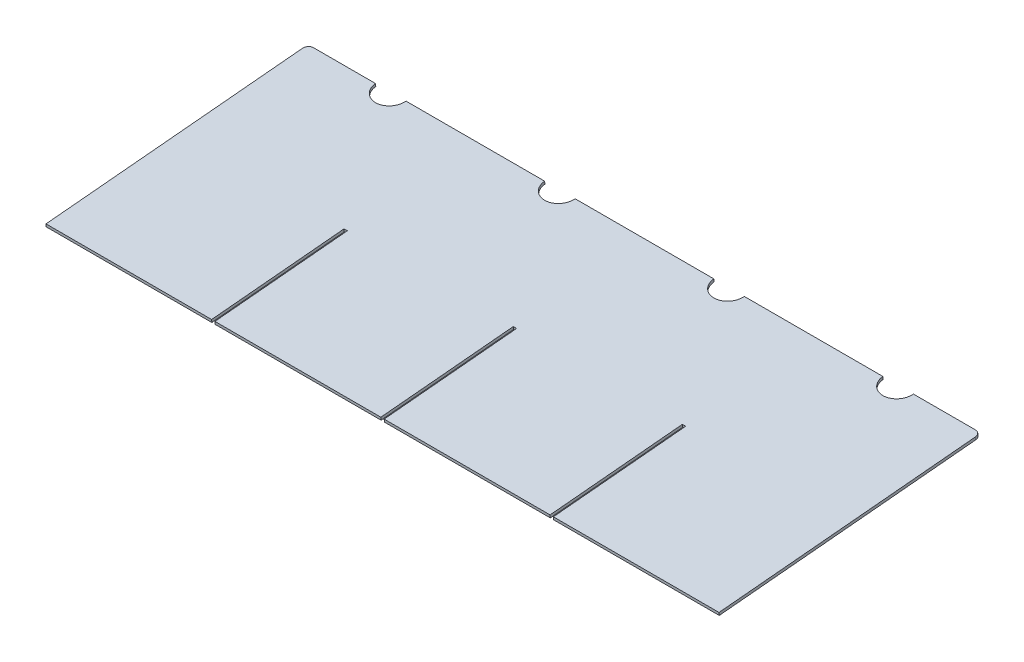
ISO-10303-21;
HEADER;
FILE_DESCRIPTION(('STEP AP214'),'2;1');
FILE_NAME('part.step','',(''),(''),'','','');
FILE_SCHEMA(('AUTOMOTIVE_DESIGN { 1 0 10303 214 1 1 1 1 }'));
ENDSEC;
DATA;
#1=APPLICATION_CONTEXT('core data for automotive mechanical design processes');
#2=APPLICATION_PROTOCOL_DEFINITION('international standard','automotive_design',2000,#1);
#3=PRODUCT_CONTEXT('',#1,'mechanical');
#4=PRODUCT('Part','Part','',(#3));
#5=PRODUCT_RELATED_PRODUCT_CATEGORY('part','',(#4));
#6=PRODUCT_DEFINITION_FORMATION('','',#4);
#7=PRODUCT_DEFINITION_CONTEXT('part definition',#1,'design');
#8=PRODUCT_DEFINITION('design','',#6,#7);
#9=PRODUCT_DEFINITION_SHAPE('','',#8);
#10=(LENGTH_UNIT() NAMED_UNIT(*) SI_UNIT(.MILLI.,.METRE.));
#11=(NAMED_UNIT(*) PLANE_ANGLE_UNIT() SI_UNIT($,.RADIAN.));
#12=(NAMED_UNIT(*) SI_UNIT($,.STERADIAN.) SOLID_ANGLE_UNIT());
#13=UNCERTAINTY_MEASURE_WITH_UNIT(LENGTH_MEASURE(1.E-05),#10,'distance_accuracy_value','');
#14=(GEOMETRIC_REPRESENTATION_CONTEXT(3) GLOBAL_UNCERTAINTY_ASSIGNED_CONTEXT((#13)) GLOBAL_UNIT_ASSIGNED_CONTEXT((#10,
#11,#12)) REPRESENTATION_CONTEXT('',''));
#15=CARTESIAN_POINT('',(0.,0.,0.));
#16=DIRECTION('',(0.,0.,1.));
#17=DIRECTION('',(1.,0.,0.));
#18=AXIS2_PLACEMENT_3D('',#15,#16,#17);
#19=CARTESIAN_POINT('',(61.7000000001972,-30.8304466529325,906.628961888731));
#20=DIRECTION('',(0.,-0.0925004132672426,0.995712646070838));
#21=DIRECTION('',(0.,-0.995712646070838,-0.0925004132672426));
#22=AXIS2_PLACEMENT_3D('',#19,#20,#21);
#23=PLANE('',#22);
#24=DIRECTION('',(1.,0.,0.));
#25=VECTOR('',#24,1.);
#26=CARTESIAN_POINT('',(61.7000000001972,-29.8347340068617,906.721462301998));
#27=LINE('',#26,#25);
#28=CARTESIAN_POINT('',(61.7000000001972,-29.8347340068617,906.721462301998));
#29=VERTEX_POINT('',#28);
#30=CARTESIAN_POINT('',(121.500000000197,-29.834734006862,906.721462301998));
#31=VERTEX_POINT('',#30);
#32=EDGE_CURVE('E239',#29,#31,#27,.T.);
#33=ORIENTED_EDGE('',*,*,#32,.F.);
#34=DIRECTION('',(0.,0.995712646070838,0.0925004132672426));
#35=VECTOR('',#34,1.);
#36=CARTESIAN_POINT('',(61.7000000001972,-30.8304466529325,906.628961888731));
#37=LINE('',#36,#35);
#38=CARTESIAN_POINT('',(61.7000000001972,-30.8304466529325,906.628961888731));
#39=VERTEX_POINT('',#38);
#40=EDGE_CURVE('E11',#39,#29,#37,.T.);
#41=ORIENTED_EDGE('',*,*,#40,.F.);
#42=DIRECTION('',(1.,0.,0.));
#43=VECTOR('',#42,1.);
#44=CARTESIAN_POINT('',(61.7000000001972,-30.8304466529325,906.628961888731));
#45=LINE('',#44,#43);
#46=CARTESIAN_POINT('',(121.500000000197,-30.8304466529328,906.628961888731));
#47=VERTEX_POINT('',#46);
#48=EDGE_CURVE('E313',#39,#47,#45,.T.);
#49=ORIENTED_EDGE('',*,*,#48,.T.);
#50=DIRECTION('',(0.,0.995712646070838,0.0925004132672426));
#51=VECTOR('',#50,1.);
#52=CARTESIAN_POINT('',(121.500000000197,-30.8304466529328,906.628961888731));
#53=LINE('',#52,#51);
#54=EDGE_CURVE('E37',#47,#31,#53,.T.);
#55=ORIENTED_EDGE('',*,*,#54,.T.);
#56=EDGE_LOOP('',(#33,#41,#49,#55));
#57=FACE_BOUND('',#56,.T.);
#58=ADVANCED_FACE('F34',(#57),#23,.T.);
#59=CARTESIAN_POINT('',(61.7000000001972,-26.3904268161048,858.83475487733));
#60=DIRECTION('',(-1.,0.,0.));
#61=DIRECTION('',(0.,-1.,0.));
#62=AXIS2_PLACEMENT_3D('',#59,#60,#61);
#63=PLANE('',#62);
#64=DIRECTION('',(0.,-0.0925004132672426,0.995712646070838));
#65=VECTOR('',#64,1.);
#66=CARTESIAN_POINT('',(61.7000000001972,-25.3947141700339,858.927255290597));
#67=LINE('',#66,#65);
#68=CARTESIAN_POINT('',(61.7000000001972,-25.3947141700339,858.927255290597));
#69=VERTEX_POINT('',#68);
#70=EDGE_CURVE('E311',#69,#29,#67,.T.);
#71=ORIENTED_EDGE('',*,*,#70,.F.);
#72=DIRECTION('',(0.,0.995712646070838,0.0925004132672426));
#73=VECTOR('',#72,1.);
#74=CARTESIAN_POINT('',(61.7000000001972,-26.3904268161048,858.83475487733));
#75=LINE('',#74,#73);
#76=CARTESIAN_POINT('',(61.7000000001972,-26.3904268161048,858.83475487733));
#77=VERTEX_POINT('',#76);
#78=EDGE_CURVE('E43',#77,#69,#75,.T.);
#79=ORIENTED_EDGE('',*,*,#78,.F.);
#80=DIRECTION('',(0.,-0.0925004132672426,0.995712646070838));
#81=VECTOR('',#80,1.);
#82=CARTESIAN_POINT('',(61.7000000001972,-26.3904268161048,858.83475487733));
#83=LINE('',#82,#81);
#84=EDGE_CURVE('E229',#77,#39,#83,.T.);
#85=ORIENTED_EDGE('',*,*,#84,.T.);
#86=ORIENTED_EDGE('',*,*,#40,.T.);
#87=EDGE_LOOP('',(#71,#79,#85,#86));
#88=FACE_BOUND('',#87,.T.);
#89=ADVANCED_FACE('F361',(#88),#63,.T.);
#90=CARTESIAN_POINT('',(60.5000000001972,-26.3913263339,858.84443765833));
#91=DIRECTION('',(0.00810346164109908,-0.0924973761471252,0.995679953255728));
#92=DIRECTION('',(0.,-0.995712646070838,-0.0925004132672426));
#93=AXIS2_PLACEMENT_3D('',#90,#91,#92);
#94=PLANE('',#93);
#95=DIRECTION('',(0.999967166415694,0.000749573550690543,-0.00806871923299289));
#96=VECTOR('',#95,1.);
#97=CARTESIAN_POINT('',(60.5000000001972,-25.3956136878292,858.936938071597));
#98=LINE('',#97,#96);
#99=CARTESIAN_POINT('',(60.5000000001972,-25.3956136878292,858.936938071597));
#100=VERTEX_POINT('',#99);
#101=EDGE_CURVE('E216',#100,#69,#98,.T.);
#102=ORIENTED_EDGE('',*,*,#101,.F.);
#103=DIRECTION('',(0.,0.995712646070838,0.0925004132672426));
#104=VECTOR('',#103,1.);
#105=CARTESIAN_POINT('',(60.5000000001972,-26.3913263339,858.84443765833));
#106=LINE('',#105,#104);
#107=CARTESIAN_POINT('',(60.5000000001972,-26.3913263339,858.84443765833));
#108=VERTEX_POINT('',#107);
#109=EDGE_CURVE('E211',#108,#100,#106,.T.);
#110=ORIENTED_EDGE('',*,*,#109,.F.);
#111=DIRECTION('',(0.999967166415694,0.000749573550690543,-0.00806871923299289));
#112=VECTOR('',#111,1.);
#113=CARTESIAN_POINT('',(60.5000000001972,-26.3913263339,858.84443765833));
#114=LINE('',#113,#112);
#115=EDGE_CURVE('E214',#108,#77,#114,.T.);
#116=ORIENTED_EDGE('',*,*,#115,.T.);
#117=ORIENTED_EDGE('',*,*,#78,.T.);
#118=EDGE_LOOP('',(#102,#110,#116,#117));
#119=FACE_BOUND('',#118,.T.);
#120=ADVANCED_FACE('F213',(#119),#94,.T.);
#121=CARTESIAN_POINT('',(60.5000000001972,-30.8304466529325,906.628961888731));
#122=DIRECTION('',(1.,0.,0.));
#123=DIRECTION('',(0.,1.,0.));
#124=AXIS2_PLACEMENT_3D('',#121,#122,#123);
#125=PLANE('',#124);
#126=DIRECTION('',(0.,0.0925004132672425,-0.995712646070838));
#127=VECTOR('',#126,1.);
#128=CARTESIAN_POINT('',(60.5000000001972,-29.8347340068616,906.721462301998));
#129=LINE('',#128,#127);
#130=CARTESIAN_POINT('',(60.5000000001972,-29.8347340068616,906.721462301998));
#131=VERTEX_POINT('',#130);
#132=EDGE_CURVE('E308',#131,#100,#129,.T.);
#133=ORIENTED_EDGE('',*,*,#132,.F.);
#134=DIRECTION('',(0.,0.995712646070838,0.0925004132672426));
#135=VECTOR('',#134,1.);
#136=CARTESIAN_POINT('',(60.5000000001972,-30.8304466529325,906.628961888731));
#137=LINE('',#136,#135);
#138=CARTESIAN_POINT('',(60.5000000001972,-30.8304466529325,906.628961888731));
#139=VERTEX_POINT('',#138);
#140=EDGE_CURVE('E221',#139,#131,#137,.T.);
#141=ORIENTED_EDGE('',*,*,#140,.F.);
#142=DIRECTION('',(0.,0.0925004132672425,-0.995712646070838));
#143=VECTOR('',#142,1.);
#144=CARTESIAN_POINT('',(60.5000000001972,-30.8304466529325,906.628961888731));
#145=LINE('',#144,#143);
#146=EDGE_CURVE('E227',#139,#108,#145,.T.);
#147=ORIENTED_EDGE('',*,*,#146,.T.);
#148=ORIENTED_EDGE('',*,*,#109,.T.);
#149=EDGE_LOOP('',(#133,#141,#147,#148));
#150=FACE_BOUND('',#149,.T.);
#151=ADVANCED_FACE('F231',(#150),#125,.T.);
#152=CARTESIAN_POINT('',(0.600000000197105,-30.8304466529322,906.628961888731));
#153=DIRECTION('',(0.,-0.0925004132672426,0.995712646070838));
#154=DIRECTION('',(0.,-0.995712646070838,-0.0925004132672426));
#155=AXIS2_PLACEMENT_3D('',#152,#153,#154);
#156=PLANE('',#155);
#157=DIRECTION('',(1.,0.,0.));
#158=VECTOR('',#157,1.);
#159=CARTESIAN_POINT('',(0.60000000019711,-29.8347340068613,906.721462301998));
#160=LINE('',#159,#158);
#161=CARTESIAN_POINT('',(0.60000000019711,-29.8347340068613,906.721462301998));
#162=VERTEX_POINT('',#161);
#163=EDGE_CURVE('E305',#162,#131,#160,.T.);
#164=ORIENTED_EDGE('',*,*,#163,.F.);
#165=DIRECTION('',(0.,0.995712646070838,0.0925004132672426));
#166=VECTOR('',#165,1.);
#167=CARTESIAN_POINT('',(0.600000000197105,-30.8304466529322,906.628961888731));
#168=LINE('',#167,#166);
#169=CARTESIAN_POINT('',(0.600000000197105,-30.8304466529322,906.628961888731));
#170=VERTEX_POINT('',#169);
#171=EDGE_CURVE('E317',#170,#162,#168,.T.);
#172=ORIENTED_EDGE('',*,*,#171,.F.);
#173=DIRECTION('',(1.,0.,0.));
#174=VECTOR('',#173,1.);
#175=CARTESIAN_POINT('',(0.600000000197105,-30.8304466529322,906.628961888731));
#176=LINE('',#175,#174);
#177=EDGE_CURVE('E232',#170,#139,#176,.T.);
#178=ORIENTED_EDGE('',*,*,#177,.T.);
#179=ORIENTED_EDGE('',*,*,#140,.T.);
#180=EDGE_LOOP('',(#164,#172,#178,#179));
#181=FACE_BOUND('',#180,.T.);
#182=ADVANCED_FACE('F374',(#181),#156,.T.);
#183=CARTESIAN_POINT('',(0.600000000197216,-26.3904268161045,858.834754877331));
#184=DIRECTION('',(-1.,0.,0.));
#185=DIRECTION('',(0.,-1.,0.));
#186=AXIS2_PLACEMENT_3D('',#183,#184,#185);
#187=PLANE('',#186);
#188=DIRECTION('',(0.,-0.0925004132672426,0.995712646070838));
#189=VECTOR('',#188,1.);
#190=CARTESIAN_POINT('',(0.600000000197221,-25.3947141700337,858.927255290598));
#191=LINE('',#190,#189);
#192=CARTESIAN_POINT('',(0.600000000197221,-25.3947141700337,858.927255290598));
#193=VERTEX_POINT('',#192);
#194=EDGE_CURVE('E302',#193,#162,#191,.T.);
#195=ORIENTED_EDGE('',*,*,#194,.F.);
#196=DIRECTION('',(0.,0.995712646070838,0.0925004132672426));
#197=VECTOR('',#196,1.);
#198=CARTESIAN_POINT('',(0.600000000197216,-26.3904268161045,858.834754877331));
#199=LINE('',#198,#197);
#200=CARTESIAN_POINT('',(0.600000000197216,-26.3904268161045,858.834754877331));
#201=VERTEX_POINT('',#200);
#202=EDGE_CURVE('E319',#201,#193,#199,.T.);
#203=ORIENTED_EDGE('',*,*,#202,.F.);
#204=DIRECTION('',(0.,-0.0925004132672426,0.995712646070838));
#205=VECTOR('',#204,1.);
#206=CARTESIAN_POINT('',(0.600000000197216,-26.3904268161045,858.834754877331));
#207=LINE('',#206,#205);
#208=EDGE_CURVE('E234',#201,#170,#207,.T.);
#209=ORIENTED_EDGE('',*,*,#208,.T.);
#210=ORIENTED_EDGE('',*,*,#171,.T.);
#211=EDGE_LOOP('',(#195,#203,#209,#210));
#212=FACE_BOUND('',#211,.T.);
#213=ADVANCED_FACE('F377',(#212),#187,.T.);
#214=CARTESIAN_POINT('',(-0.599999999802874,-26.3904268161045,858.83475487733));
#215=DIRECTION('',(-7.4339390925609E-13,-0.0925004132672426,0.995712646070838));
#216=DIRECTION('',(0.,-0.995712646070838,-0.0925004132672426));
#217=AXIS2_PLACEMENT_3D('',#214,#215,#216);
#218=PLANE('',#217);
#219=DIRECTION('',(1.,0.,7.40148683083382E-13));
#220=VECTOR('',#219,1.);
#221=CARTESIAN_POINT('',(-0.599999999802869,-25.3947141700336,858.927255290597));
#222=LINE('',#221,#220);
#223=CARTESIAN_POINT('',(-0.599999999802869,-25.3947141700336,858.927255290597));
#224=VERTEX_POINT('',#223);
#225=EDGE_CURVE('E299',#224,#193,#222,.T.);
#226=ORIENTED_EDGE('',*,*,#225,.F.);
#227=DIRECTION('',(0.,0.995712646070838,0.0925004132672426));
#228=VECTOR('',#227,1.);
#229=CARTESIAN_POINT('',(-0.599999999802874,-26.3904268161045,858.83475487733));
#230=LINE('',#229,#228);
#231=CARTESIAN_POINT('',(-0.599999999802874,-26.3904268161045,858.83475487733));
#232=VERTEX_POINT('',#231);
#233=EDGE_CURVE('E321',#232,#224,#230,.T.);
#234=ORIENTED_EDGE('',*,*,#233,.F.);
#235=DIRECTION('',(1.,0.,7.40148683083382E-13));
#236=VECTOR('',#235,1.);
#237=CARTESIAN_POINT('',(-0.599999999802874,-26.3904268161045,858.83475487733));
#238=LINE('',#237,#236);
#239=EDGE_CURVE('E698',#232,#201,#238,.T.);
#240=ORIENTED_EDGE('',*,*,#239,.T.);
#241=ORIENTED_EDGE('',*,*,#202,.T.);
#242=EDGE_LOOP('',(#226,#234,#240,#241));
#243=FACE_BOUND('',#242,.T.);
#244=ADVANCED_FACE('F381',(#243),#218,.T.);
#245=CARTESIAN_POINT('',(-0.599999999802874,-30.8304466529322,906.628961888731));
#246=DIRECTION('',(1.,0.,0.));
#247=DIRECTION('',(0.,1.,0.));
#248=AXIS2_PLACEMENT_3D('',#245,#246,#247);
#249=PLANE('',#248);
#250=DIRECTION('',(0.,0.0925004132672426,-0.995712646070838));
#251=VECTOR('',#250,1.);
#252=CARTESIAN_POINT('',(-0.599999999802869,-29.8347340068613,906.721462301998));
#253=LINE('',#252,#251);
#254=CARTESIAN_POINT('',(-0.599999999802869,-29.8347340068613,906.721462301998));
#255=VERTEX_POINT('',#254);
#256=EDGE_CURVE('E296',#255,#224,#253,.T.);
#257=ORIENTED_EDGE('',*,*,#256,.F.);
#258=DIRECTION('',(0.,0.995712646070838,0.0925004132672426));
#259=VECTOR('',#258,1.);
#260=CARTESIAN_POINT('',(-0.599999999802874,-30.8304466529322,906.628961888731));
#261=LINE('',#260,#259);
#262=CARTESIAN_POINT('',(-0.599999999802874,-30.8304466529322,906.628961888731));
#263=VERTEX_POINT('',#262);
#264=EDGE_CURVE('E323',#263,#255,#261,.T.);
#265=ORIENTED_EDGE('',*,*,#264,.F.);
#266=DIRECTION('',(0.,0.0925004132672426,-0.995712646070838));
#267=VECTOR('',#266,1.);
#268=CARTESIAN_POINT('',(-0.599999999802874,-30.8304466529322,906.628961888731));
#269=LINE('',#268,#267);
#270=EDGE_CURVE('E691',#263,#232,#269,.T.);
#271=ORIENTED_EDGE('',*,*,#270,.T.);
#272=ORIENTED_EDGE('',*,*,#233,.T.);
#273=EDGE_LOOP('',(#257,#265,#271,#272));
#274=FACE_BOUND('',#273,.T.);
#275=ADVANCED_FACE('F385',(#274),#249,.T.);
#276=CARTESIAN_POINT('',(-60.4999999998028,-30.8304466529319,906.628961888731));
#277=DIRECTION('',(0.,-0.0925004132672426,0.995712646070838));
#278=DIRECTION('',(0.,-0.995712646070838,-0.0925004132672426));
#279=AXIS2_PLACEMENT_3D('',#276,#277,#278);
#280=PLANE('',#279);
#281=DIRECTION('',(1.,0.,0.));
#282=VECTOR('',#281,1.);
#283=CARTESIAN_POINT('',(-60.4999999998028,-29.834734006861,906.721462301998));
#284=LINE('',#283,#282);
#285=CARTESIAN_POINT('',(-60.4999999998028,-29.834734006861,906.721462301998));
#286=VERTEX_POINT('',#285);
#287=EDGE_CURVE('E293',#286,#255,#284,.T.);
#288=ORIENTED_EDGE('',*,*,#287,.F.);
#289=DIRECTION('',(0.,0.995712646070838,0.0925004132672426));
#290=VECTOR('',#289,1.);
#291=CARTESIAN_POINT('',(-60.4999999998028,-30.8304466529319,906.628961888731));
#292=LINE('',#291,#290);
#293=CARTESIAN_POINT('',(-60.4999999998028,-30.8304466529319,906.628961888731));
#294=VERTEX_POINT('',#293);
#295=EDGE_CURVE('E325',#294,#286,#292,.T.);
#296=ORIENTED_EDGE('',*,*,#295,.F.);
#297=DIRECTION('',(1.,0.,0.));
#298=VECTOR('',#297,1.);
#299=CARTESIAN_POINT('',(-60.4999999998028,-30.8304466529319,906.628961888731));
#300=LINE('',#299,#298);
#301=EDGE_CURVE('E687',#294,#263,#300,.T.);
#302=ORIENTED_EDGE('',*,*,#301,.T.);
#303=ORIENTED_EDGE('',*,*,#264,.T.);
#304=EDGE_LOOP('',(#288,#296,#302,#303));
#305=FACE_BOUND('',#304,.T.);
#306=ADVANCED_FACE('F389',(#305),#280,.T.);
#307=CARTESIAN_POINT('',(-60.4999999998028,-26.3904268161042,858.83475487733));
#308=DIRECTION('',(-1.,0.,0.));
#309=DIRECTION('',(0.,-1.,0.));
#310=AXIS2_PLACEMENT_3D('',#307,#308,#309);
#311=PLANE('',#310);
#312=DIRECTION('',(0.,-0.0925004132672426,0.995712646070838));
#313=VECTOR('',#312,1.);
#314=CARTESIAN_POINT('',(-60.4999999998028,-25.3947141700333,858.927255290597));
#315=LINE('',#314,#313);
#316=CARTESIAN_POINT('',(-60.4999999998028,-25.3947141700333,858.927255290597));
#317=VERTEX_POINT('',#316);
#318=EDGE_CURVE('E290',#317,#286,#315,.T.);
#319=ORIENTED_EDGE('',*,*,#318,.F.);
#320=DIRECTION('',(0.,0.995712646070838,0.0925004132672426));
#321=VECTOR('',#320,1.);
#322=CARTESIAN_POINT('',(-60.4999999998028,-26.3904268161042,858.83475487733));
#323=LINE('',#322,#321);
#324=CARTESIAN_POINT('',(-60.4999999998028,-26.3904268161042,858.83475487733));
#325=VERTEX_POINT('',#324);
#326=EDGE_CURVE('E327',#325,#317,#323,.T.);
#327=ORIENTED_EDGE('',*,*,#326,.F.);
#328=DIRECTION('',(0.,-0.0925004132672426,0.995712646070838));
#329=VECTOR('',#328,1.);
#330=CARTESIAN_POINT('',(-60.4999999998028,-26.3904268161042,858.83475487733));
#331=LINE('',#330,#329);
#332=EDGE_CURVE('E703',#325,#294,#331,.T.);
#333=ORIENTED_EDGE('',*,*,#332,.T.);
#334=ORIENTED_EDGE('',*,*,#295,.T.);
#335=EDGE_LOOP('',(#319,#327,#333,#334));
#336=FACE_BOUND('',#335,.T.);
#337=ADVANCED_FACE('F393',(#336),#311,.T.);
#338=CARTESIAN_POINT('',(-61.6999999998028,-26.3895094566338,858.824880041171));
#339=DIRECTION('',(-0.00826418058718151,-0.0924972544777096,0.995678643555896));
#340=DIRECTION('',(0.,-0.995712646070838,-0.0925004132672425));
#341=AXIS2_PLACEMENT_3D('',#338,#339,#340);
#342=PLANE('',#341);
#343=DIRECTION('',(0.999965851076537,-0.000764440119635503,0.00822874912006918));
#344=VECTOR('',#343,1.);
#345=CARTESIAN_POINT('',(-61.6999999998028,-25.3937968105629,858.917380454438));
#346=LINE('',#345,#344);
#347=CARTESIAN_POINT('',(-61.6999999998028,-25.3937968105629,858.917380454438));
#348=VERTEX_POINT('',#347);
#349=EDGE_CURVE('E287',#348,#317,#346,.T.);
#350=ORIENTED_EDGE('',*,*,#349,.F.);
#351=DIRECTION('',(0.,0.995712646070838,0.0925004132672426));
#352=VECTOR('',#351,1.);
#353=CARTESIAN_POINT('',(-61.6999999998028,-26.3895094566338,858.824880041171));
#354=LINE('',#353,#352);
#355=CARTESIAN_POINT('',(-61.6999999998028,-26.3895094566338,858.824880041171));
#356=VERTEX_POINT('',#355);
#357=EDGE_CURVE('E329',#356,#348,#354,.T.);
#358=ORIENTED_EDGE('',*,*,#357,.F.);
#359=DIRECTION('',(0.999965851076537,-0.000764440119635503,0.00822874912006918));
#360=VECTOR('',#359,1.);
#361=CARTESIAN_POINT('',(-61.6999999998028,-26.3895094566338,858.824880041171));
#362=LINE('',#361,#360);
#363=EDGE_CURVE('E680',#356,#325,#362,.T.);
#364=ORIENTED_EDGE('',*,*,#363,.T.);
#365=ORIENTED_EDGE('',*,*,#326,.T.);
#366=EDGE_LOOP('',(#350,#358,#364,#365));
#367=FACE_BOUND('',#366,.T.);
#368=ADVANCED_FACE('F397',(#367),#342,.T.);
#369=CARTESIAN_POINT('',(-61.6999999998028,-30.8304466529319,906.628961888731));
#370=DIRECTION('',(1.,0.,0.));
#371=DIRECTION('',(0.,1.,0.));
#372=AXIS2_PLACEMENT_3D('',#369,#370,#371);
#373=PLANE('',#372);
#374=DIRECTION('',(0.,0.0925004132672425,-0.995712646070838));
#375=VECTOR('',#374,1.);
#376=CARTESIAN_POINT('',(-61.6999999998028,-29.834734006861,906.721462301998));
#377=LINE('',#376,#375);
#378=CARTESIAN_POINT('',(-61.6999999998028,-29.834734006861,906.721462301998));
#379=VERTEX_POINT('',#378);
#380=EDGE_CURVE('E284',#379,#348,#377,.T.);
#381=ORIENTED_EDGE('',*,*,#380,.F.);
#382=DIRECTION('',(0.,0.995712646070838,0.0925004132672426));
#383=VECTOR('',#382,1.);
#384=CARTESIAN_POINT('',(-61.6999999998028,-30.8304466529319,906.628961888731));
#385=LINE('',#384,#383);
#386=CARTESIAN_POINT('',(-61.6999999998028,-30.8304466529319,906.628961888731));
#387=VERTEX_POINT('',#386);
#388=EDGE_CURVE('E331',#387,#379,#385,.T.);
#389=ORIENTED_EDGE('',*,*,#388,.F.);
#390=DIRECTION('',(0.,0.0925004132672425,-0.995712646070838));
#391=VECTOR('',#390,1.);
#392=CARTESIAN_POINT('',(-61.6999999998028,-30.8304466529319,906.628961888731));
#393=LINE('',#392,#391);
#394=EDGE_CURVE('E676',#387,#356,#393,.T.);
#395=ORIENTED_EDGE('',*,*,#394,.T.);
#396=ORIENTED_EDGE('',*,*,#357,.T.);
#397=EDGE_LOOP('',(#381,#389,#395,#396));
#398=FACE_BOUND('',#397,.T.);
#399=ADVANCED_FACE('F401',(#398),#373,.T.);
#400=CARTESIAN_POINT('',(-121.499999999803,-30.8304466529316,906.628961888731));
#401=DIRECTION('',(0.,-0.0925004132672426,0.995712646070838));
#402=DIRECTION('',(0.,-0.995712646070838,-0.0925004132672426));
#403=AXIS2_PLACEMENT_3D('',#400,#401,#402);
#404=PLANE('',#403);
#405=DIRECTION('',(1.,0.,0.));
#406=VECTOR('',#405,1.);
#407=CARTESIAN_POINT('',(-121.499999999803,-29.8347340068607,906.721462301998));
#408=LINE('',#407,#406);
#409=CARTESIAN_POINT('',(-121.499999999803,-29.8347340068607,906.721462301998));
#410=VERTEX_POINT('',#409);
#411=EDGE_CURVE('E281',#410,#379,#408,.T.);
#412=ORIENTED_EDGE('',*,*,#411,.F.);
#413=DIRECTION('',(0.,0.995712646070838,0.0925004132672426));
#414=VECTOR('',#413,1.);
#415=CARTESIAN_POINT('',(-121.499999999803,-30.8304466529316,906.628961888731));
#416=LINE('',#415,#414);
#417=CARTESIAN_POINT('',(-121.499999999803,-30.8304466529316,906.628961888731));
#418=VERTEX_POINT('',#417);
#419=EDGE_CURVE('E333',#418,#410,#416,.T.);
#420=ORIENTED_EDGE('',*,*,#419,.F.);
#421=DIRECTION('',(1.,0.,0.));
#422=VECTOR('',#421,1.);
#423=CARTESIAN_POINT('',(-121.499999999803,-30.8304466529316,906.628961888731));
#424=LINE('',#423,#422);
#425=EDGE_CURVE('E707',#418,#387,#424,.T.);
#426=ORIENTED_EDGE('',*,*,#425,.T.);
#427=ORIENTED_EDGE('',*,*,#388,.T.);
#428=EDGE_LOOP('',(#412,#420,#426,#427));
#429=FACE_BOUND('',#428,.T.);
#430=ADVANCED_FACE('F405',(#429),#404,.T.);
#431=CARTESIAN_POINT('',(-121.499999999803,-22.227908219078,814.027685804143));
#432=DIRECTION('',(-1.,0.,0.));
#433=DIRECTION('',(0.,-1.,0.));
#434=AXIS2_PLACEMENT_3D('',#431,#432,#433);
#435=PLANE('',#434);
#436=DIRECTION('',(0.,-0.0925004132672426,0.995712646070838));
#437=VECTOR('',#436,1.);
#438=CARTESIAN_POINT('',(-121.499999999803,-21.2321955730071,814.12018621741));
#439=LINE('',#438,#437);
#440=CARTESIAN_POINT('',(-121.499999999803,-21.2321955730071,814.12018621741));
#441=VERTEX_POINT('',#440);
#442=EDGE_CURVE('E278',#441,#410,#439,.T.);
#443=ORIENTED_EDGE('',*,*,#442,.F.);
#444=DIRECTION('',(0.,0.995712646070838,0.0925004132672426));
#445=VECTOR('',#444,1.);
#446=CARTESIAN_POINT('',(-121.499999999803,-22.227908219078,814.027685804143));
#447=LINE('',#446,#445);
#448=CARTESIAN_POINT('',(-121.499999999803,-22.227908219078,814.027685804143));
#449=VERTEX_POINT('',#448);
#450=EDGE_CURVE('E335',#449,#441,#447,.T.);
#451=ORIENTED_EDGE('',*,*,#450,.F.);
#452=DIRECTION('',(0.,-0.0925004132672426,0.995712646070838));
#453=VECTOR('',#452,1.);
#454=CARTESIAN_POINT('',(-121.499999999803,-22.227908219078,814.027685804143));
#455=LINE('',#454,#453);
#456=EDGE_CURVE('E669',#449,#418,#455,.T.);
#457=ORIENTED_EDGE('',*,*,#456,.T.);
#458=ORIENTED_EDGE('',*,*,#419,.T.);
#459=EDGE_LOOP('',(#443,#451,#457,#458));
#460=FACE_BOUND('',#459,.T.);
#461=ADVANCED_FACE('F409',(#460),#435,.T.);
#462=CARTESIAN_POINT('',(-119.499999999803,-22.227908219078,814.027685804143));
#463=DIRECTION('',(0.,0.995712646070838,0.0925004132672426));
#464=DIRECTION('',(0.,-0.0925004132672426,0.995712646070838));
#465=AXIS2_PLACEMENT_3D('',#462,#463,#464);
#466=CYLINDRICAL_SURFACE('',#465,2.00000000000012);
#467=CARTESIAN_POINT('',(-119.499999999803,-21.2321955730071,814.12018621741));
#468=DIRECTION('',(0.,0.995712646070838,0.0925004132672426));
#469=DIRECTION('',(0.,-0.0925004132672426,0.995712646070838));
#470=AXIS2_PLACEMENT_3D('',#467,#468,#469);
#471=CIRCLE('',#470,2.00000000000012);
#472=CARTESIAN_POINT('',(-119.499999999803,-21.0471947464726,812.128760925268));
#473=VERTEX_POINT('',#472);
#474=EDGE_CURVE('E275',#473,#441,#471,.T.);
#475=ORIENTED_EDGE('',*,*,#474,.F.);
#476=DIRECTION('',(0.,0.995712646070838,0.0925004132672426));
#477=VECTOR('',#476,1.);
#478=CARTESIAN_POINT('',(-119.499999999803,-22.0429073925435,812.036260512001));
#479=LINE('',#478,#477);
#480=CARTESIAN_POINT('',(-119.499999999803,-22.0429073925435,812.036260512001));
#481=VERTEX_POINT('',#480);
#482=EDGE_CURVE('E337',#481,#473,#479,.T.);
#483=ORIENTED_EDGE('',*,*,#482,.F.);
#484=CARTESIAN_POINT('',(-119.499999999803,-22.227908219078,814.027685804143));
#485=DIRECTION('',(0.,0.995712646070838,0.0925004132672426));
#486=DIRECTION('',(0.,-0.0925004132672426,0.995712646070838));
#487=AXIS2_PLACEMENT_3D('',#484,#485,#486);
#488=CIRCLE('',#487,2.00000000000012);
#489=EDGE_CURVE('E665',#481,#449,#488,.T.);
#490=ORIENTED_EDGE('',*,*,#489,.T.);
#491=ORIENTED_EDGE('',*,*,#450,.T.);
#492=EDGE_LOOP('',(#475,#483,#490,#491));
#493=FACE_BOUND('',#492,.T.);
#494=ADVANCED_FACE('F413',(#493),#466,.T.);
#495=CARTESIAN_POINT('',(-97.0999999998028,-22.0429073925436,812.036260512001));
#496=DIRECTION('',(0.,0.0925004132672426,-0.995712646070838));
#497=DIRECTION('',(0.,0.995712646070838,0.0925004132672426));
#498=AXIS2_PLACEMENT_3D('',#495,#496,#497);
#499=PLANE('',#498);
#500=DIRECTION('',(-1.,0.,0.));
#501=VECTOR('',#500,1.);
#502=CARTESIAN_POINT('',(-97.0999999998028,-21.0471947464727,812.128760925268));
#503=LINE('',#502,#501);
#504=CARTESIAN_POINT('',(-97.0999999998028,-21.0471947464727,812.128760925268));
#505=VERTEX_POINT('',#504);
#506=EDGE_CURVE('E272',#505,#473,#503,.T.);
#507=ORIENTED_EDGE('',*,*,#506,.F.);
#508=DIRECTION('',(0.,0.995712646070838,0.0925004132672426));
#509=VECTOR('',#508,1.);
#510=CARTESIAN_POINT('',(-97.0999999998028,-22.0429073925436,812.036260512001));
#511=LINE('',#510,#509);
#512=CARTESIAN_POINT('',(-97.0999999998028,-22.0429073925436,812.036260512001));
#513=VERTEX_POINT('',#512);
#514=EDGE_CURVE('E339',#513,#505,#511,.T.);
#515=ORIENTED_EDGE('',*,*,#514,.F.);
#516=DIRECTION('',(-1.,0.,0.));
#517=VECTOR('',#516,1.);
#518=CARTESIAN_POINT('',(-97.0999999998028,-22.0429073925436,812.036260512001));
#519=LINE('',#518,#517);
#520=EDGE_CURVE('E711',#513,#481,#519,.T.);
#521=ORIENTED_EDGE('',*,*,#520,.T.);
#522=ORIENTED_EDGE('',*,*,#482,.T.);
#523=EDGE_LOOP('',(#507,#515,#521,#522));
#524=FACE_BOUND('',#523,.T.);
#525=ADVANCED_FACE('F417',(#524),#499,.T.);
#526=CARTESIAN_POINT('',(-91.5999999998028,-22.0429073925436,812.036260512001));
#527=DIRECTION('',(0.,0.995712646070838,0.0925004132672426));
#528=DIRECTION('',(0.,-0.0925004132672426,0.995712646070838));
#529=AXIS2_PLACEMENT_3D('',#526,#527,#528);
#530=CYLINDRICAL_SURFACE('',#529,5.5);
#531=CARTESIAN_POINT('',(-91.5999999998028,-21.0471947464728,812.128760925268));
#532=DIRECTION('',(0.,-0.995712646070838,-0.0925004132672426));
#533=DIRECTION('',(0.,0.0925004132672426,-0.995712646070838));
#534=AXIS2_PLACEMENT_3D('',#531,#532,#533);
#535=CIRCLE('',#534,5.5);
#536=CARTESIAN_POINT('',(-86.0999999998028,-21.0471947464728,812.128760925268));
#537=VERTEX_POINT('',#536);
#538=EDGE_CURVE('E269',#537,#505,#535,.T.);
#539=ORIENTED_EDGE('',*,*,#538,.F.);
#540=DIRECTION('',(0.,0.995712646070838,0.0925004132672426));
#541=VECTOR('',#540,1.);
#542=CARTESIAN_POINT('',(-86.0999999998028,-22.0429073925436,812.036260512001));
#543=LINE('',#542,#541);
#544=CARTESIAN_POINT('',(-86.0999999998028,-22.0429073925436,812.036260512001));
#545=VERTEX_POINT('',#544);
#546=EDGE_CURVE('E341',#545,#537,#543,.T.);
#547=ORIENTED_EDGE('',*,*,#546,.F.);
#548=CARTESIAN_POINT('',(-91.5999999998028,-22.0429073925436,812.036260512001));
#549=DIRECTION('',(0.,-0.995712646070838,-0.0925004132672426));
#550=DIRECTION('',(0.,0.0925004132672426,-0.995712646070838));
#551=AXIS2_PLACEMENT_3D('',#548,#549,#550);
#552=CIRCLE('',#551,5.5);
#553=EDGE_CURVE('E658',#545,#513,#552,.T.);
#554=ORIENTED_EDGE('',*,*,#553,.T.);
#555=ORIENTED_EDGE('',*,*,#514,.T.);
#556=EDGE_LOOP('',(#539,#547,#554,#555));
#557=FACE_BOUND('',#556,.T.);
#558=ADVANCED_FACE('F421',(#557),#530,.F.);
#559=CARTESIAN_POINT('',(-36.0499999998028,-22.0429073925439,812.036260512001));
#560=DIRECTION('',(0.,0.0925004132672426,-0.995712646070838));
#561=DIRECTION('',(0.,0.995712646070838,0.0925004132672426));
#562=AXIS2_PLACEMENT_3D('',#559,#560,#561);
#563=PLANE('',#562);
#564=DIRECTION('',(-1.,0.,0.));
#565=VECTOR('',#564,1.);
#566=CARTESIAN_POINT('',(-36.0499999998028,-21.0471947464731,812.128760925268));
#567=LINE('',#566,#565);
#568=CARTESIAN_POINT('',(-36.0499999998028,-21.0471947464731,812.128760925268));
#569=VERTEX_POINT('',#568);
#570=EDGE_CURVE('E266',#569,#537,#567,.T.);
#571=ORIENTED_EDGE('',*,*,#570,.F.);
#572=DIRECTION('',(0.,0.995712646070838,0.0925004132672426));
#573=VECTOR('',#572,1.);
#574=CARTESIAN_POINT('',(-36.0499999998028,-22.0429073925439,812.036260512001));
#575=LINE('',#574,#573);
#576=CARTESIAN_POINT('',(-36.0499999998028,-22.0429073925439,812.036260512001));
#577=VERTEX_POINT('',#576);
#578=EDGE_CURVE('E343',#577,#569,#575,.T.);
#579=ORIENTED_EDGE('',*,*,#578,.F.);
#580=DIRECTION('',(-1.,0.,0.));
#581=VECTOR('',#580,1.);
#582=CARTESIAN_POINT('',(-36.0499999998028,-22.0429073925439,812.036260512001));
#583=LINE('',#582,#581);
#584=EDGE_CURVE('E654',#577,#545,#583,.T.);
#585=ORIENTED_EDGE('',*,*,#584,.T.);
#586=ORIENTED_EDGE('',*,*,#546,.T.);
#587=EDGE_LOOP('',(#571,#579,#585,#586));
#588=FACE_BOUND('',#587,.T.);
#589=ADVANCED_FACE('F425',(#588),#563,.T.);
#590=CARTESIAN_POINT('',(-30.5499999998028,-22.0429073925439,812.036260512001));
#591=DIRECTION('',(0.,0.995712646070838,0.0925004132672426));
#592=DIRECTION('',(0.,-0.0925004132672426,0.995712646070838));
#593=AXIS2_PLACEMENT_3D('',#590,#591,#592);
#594=CYLINDRICAL_SURFACE('',#593,5.5);
#595=CARTESIAN_POINT('',(-30.5499999998028,-21.0471947464731,812.128760925268));
#596=DIRECTION('',(0.,-0.995712646070838,-0.0925004132672426));
#597=DIRECTION('',(0.,0.0925004132672426,-0.995712646070838));
#598=AXIS2_PLACEMENT_3D('',#595,#596,#597);
#599=CIRCLE('',#598,5.5);
#600=CARTESIAN_POINT('',(-25.0499999998028,-21.0471947464731,812.128760925268));
#601=VERTEX_POINT('',#600);
#602=EDGE_CURVE('E263',#601,#569,#599,.T.);
#603=ORIENTED_EDGE('',*,*,#602,.F.);
#604=DIRECTION('',(0.,0.995712646070838,0.0925004132672426));
#605=VECTOR('',#604,1.);
#606=CARTESIAN_POINT('',(-25.0499999998029,-22.042907392544,812.036260512001));
#607=LINE('',#606,#605);
#608=CARTESIAN_POINT('',(-25.0499999998029,-22.042907392544,812.036260512001));
#609=VERTEX_POINT('',#608);
#610=EDGE_CURVE('E345',#609,#601,#607,.T.);
#611=ORIENTED_EDGE('',*,*,#610,.F.);
#612=CARTESIAN_POINT('',(-30.5499999998028,-22.0429073925439,812.036260512001));
#613=DIRECTION('',(0.,-0.995712646070838,-0.0925004132672426));
#614=DIRECTION('',(0.,0.0925004132672426,-0.995712646070838));
#615=AXIS2_PLACEMENT_3D('',#612,#613,#614);
#616=CIRCLE('',#615,5.5);
#617=EDGE_CURVE('E715',#609,#577,#616,.T.);
#618=ORIENTED_EDGE('',*,*,#617,.T.);
#619=ORIENTED_EDGE('',*,*,#578,.T.);
#620=EDGE_LOOP('',(#603,#611,#618,#619));
#621=FACE_BOUND('',#620,.T.);
#622=ADVANCED_FACE('F429',(#621),#594,.F.);
#623=CARTESIAN_POINT('',(25.0500000001972,-22.0429073925442,812.036260512001));
#624=DIRECTION('',(0.,0.0925004132672426,-0.995712646070838));
#625=DIRECTION('',(0.,0.995712646070838,0.0925004132672426));
#626=AXIS2_PLACEMENT_3D('',#623,#624,#625);
#627=PLANE('',#626);
#628=DIRECTION('',(-1.,0.,0.));
#629=VECTOR('',#628,1.);
#630=CARTESIAN_POINT('',(25.0500000001972,-21.0471947464734,812.128760925268));
#631=LINE('',#630,#629);
#632=CARTESIAN_POINT('',(25.0500000001972,-21.0471947464734,812.128760925268));
#633=VERTEX_POINT('',#632);
#634=EDGE_CURVE('E260',#633,#601,#631,.T.);
#635=ORIENTED_EDGE('',*,*,#634,.F.);
#636=DIRECTION('',(0.,0.995712646070838,0.0925004132672426));
#637=VECTOR('',#636,1.);
#638=CARTESIAN_POINT('',(25.0500000001971,-22.0429073925442,812.036260512001));
#639=LINE('',#638,#637);
#640=CARTESIAN_POINT('',(25.0500000001971,-22.0429073925442,812.036260512001));
#641=VERTEX_POINT('',#640);
#642=EDGE_CURVE('E347',#641,#633,#639,.T.);
#643=ORIENTED_EDGE('',*,*,#642,.F.);
#644=DIRECTION('',(-1.,0.,0.));
#645=VECTOR('',#644,1.);
#646=CARTESIAN_POINT('',(25.0500000001972,-22.0429073925442,812.036260512001));
#647=LINE('',#646,#645);
#648=EDGE_CURVE('E647',#641,#609,#647,.T.);
#649=ORIENTED_EDGE('',*,*,#648,.T.);
#650=ORIENTED_EDGE('',*,*,#610,.T.);
#651=EDGE_LOOP('',(#635,#643,#649,#650));
#652=FACE_BOUND('',#651,.T.);
#653=ADVANCED_FACE('F433',(#652),#627,.T.);
#654=CARTESIAN_POINT('',(30.5500000001971,-22.0429073925442,812.036260512001));
#655=DIRECTION('',(0.,0.995712646070838,0.0925004132672426));
#656=DIRECTION('',(0.,-0.0925004132672426,0.995712646070838));
#657=AXIS2_PLACEMENT_3D('',#654,#655,#656);
#658=CYLINDRICAL_SURFACE('',#657,5.5);
#659=CARTESIAN_POINT('',(30.5500000001972,-21.0471947464734,812.128760925268));
#660=DIRECTION('',(0.,-0.995712646070838,-0.0925004132672426));
#661=DIRECTION('',(0.,0.0925004132672426,-0.995712646070838));
#662=AXIS2_PLACEMENT_3D('',#659,#660,#661);
#663=CIRCLE('',#662,5.5);
#664=CARTESIAN_POINT('',(36.0500000001972,-21.0471947464734,812.128760925268));
#665=VERTEX_POINT('',#664);
#666=EDGE_CURVE('E257',#665,#633,#663,.T.);
#667=ORIENTED_EDGE('',*,*,#666,.F.);
#668=DIRECTION('',(0.,0.995712646070838,0.0925004132672426));
#669=VECTOR('',#668,1.);
#670=CARTESIAN_POINT('',(36.0500000001972,-22.0429073925443,812.036260512001));
#671=LINE('',#670,#669);
#672=CARTESIAN_POINT('',(36.0500000001972,-22.0429073925443,812.036260512001));
#673=VERTEX_POINT('',#672);
#674=EDGE_CURVE('E349',#673,#665,#671,.T.);
#675=ORIENTED_EDGE('',*,*,#674,.F.);
#676=CARTESIAN_POINT('',(30.5500000001971,-22.0429073925442,812.036260512001));
#677=DIRECTION('',(0.,-0.995712646070838,-0.0925004132672426));
#678=DIRECTION('',(0.,0.0925004132672426,-0.995712646070838));
#679=AXIS2_PLACEMENT_3D('',#676,#677,#678);
#680=CIRCLE('',#679,5.5);
#681=EDGE_CURVE('E643',#673,#641,#680,.T.);
#682=ORIENTED_EDGE('',*,*,#681,.T.);
#683=ORIENTED_EDGE('',*,*,#642,.T.);
#684=EDGE_LOOP('',(#667,#675,#682,#683));
#685=FACE_BOUND('',#684,.T.);
#686=ADVANCED_FACE('F437',(#685),#658,.F.);
#687=CARTESIAN_POINT('',(86.1000000001971,-22.0429073925445,812.036260512001));
#688=DIRECTION('',(0.,0.0925004132672426,-0.995712646070838));
#689=DIRECTION('',(0.,0.995712646070838,0.0925004132672426));
#690=AXIS2_PLACEMENT_3D('',#687,#688,#689);
#691=PLANE('',#690);
#692=DIRECTION('',(-1.,0.,0.));
#693=VECTOR('',#692,1.);
#694=CARTESIAN_POINT('',(86.1000000001971,-21.0471947464737,812.128760925268));
#695=LINE('',#694,#693);
#696=CARTESIAN_POINT('',(86.1000000001971,-21.0471947464737,812.128760925268));
#697=VERTEX_POINT('',#696);
#698=EDGE_CURVE('E254',#697,#665,#695,.T.);
#699=ORIENTED_EDGE('',*,*,#698,.F.);
#700=DIRECTION('',(0.,0.995712646070838,0.0925004132672426));
#701=VECTOR('',#700,1.);
#702=CARTESIAN_POINT('',(86.1000000001971,-22.0429073925445,812.036260512001));
#703=LINE('',#702,#701);
#704=CARTESIAN_POINT('',(86.1000000001971,-22.0429073925445,812.036260512001));
#705=VERTEX_POINT('',#704);
#706=EDGE_CURVE('E351',#705,#697,#703,.T.);
#707=ORIENTED_EDGE('',*,*,#706,.F.);
#708=DIRECTION('',(-1.,0.,0.));
#709=VECTOR('',#708,1.);
#710=CARTESIAN_POINT('',(86.1000000001971,-22.0429073925445,812.036260512001));
#711=LINE('',#710,#709);
#712=EDGE_CURVE('E719',#705,#673,#711,.T.);
#713=ORIENTED_EDGE('',*,*,#712,.T.);
#714=ORIENTED_EDGE('',*,*,#674,.T.);
#715=EDGE_LOOP('',(#699,#707,#713,#714));
#716=FACE_BOUND('',#715,.T.);
#717=ADVANCED_FACE('F441',(#716),#691,.T.);
#718=CARTESIAN_POINT('',(91.6000000001972,-22.0429073925446,812.036260512001));
#719=DIRECTION('',(0.,0.995712646070838,0.0925004132672426));
#720=DIRECTION('',(0.,-0.0925004132672426,0.995712646070838));
#721=AXIS2_PLACEMENT_3D('',#718,#719,#720);
#722=CYLINDRICAL_SURFACE('',#721,5.5000000000001);
#723=CARTESIAN_POINT('',(91.6000000001972,-21.0471947464737,812.128760925268));
#724=DIRECTION('',(0.,-0.995712646070838,-0.0925004132672426));
#725=DIRECTION('',(0.,0.0925004132672426,-0.995712646070838));
#726=AXIS2_PLACEMENT_3D('',#723,#724,#725);
#727=CIRCLE('',#726,5.5000000000001);
#728=CARTESIAN_POINT('',(97.1000000001973,-21.0471947464737,812.128760925268));
#729=VERTEX_POINT('',#728);
#730=EDGE_CURVE('E251',#729,#697,#727,.T.);
#731=ORIENTED_EDGE('',*,*,#730,.F.);
#732=DIRECTION('',(0.,0.995712646070838,0.0925004132672426));
#733=VECTOR('',#732,1.);
#734=CARTESIAN_POINT('',(97.1000000001973,-22.0429073925446,812.036260512001));
#735=LINE('',#734,#733);
#736=CARTESIAN_POINT('',(97.1000000001973,-22.0429073925446,812.036260512001));
#737=VERTEX_POINT('',#736);
#738=EDGE_CURVE('E353',#737,#729,#735,.T.);
#739=ORIENTED_EDGE('',*,*,#738,.F.);
#740=CARTESIAN_POINT('',(91.6000000001972,-22.0429073925446,812.036260512001));
#741=DIRECTION('',(0.,-0.995712646070838,-0.0925004132672426));
#742=DIRECTION('',(0.,0.0925004132672426,-0.995712646070838));
#743=AXIS2_PLACEMENT_3D('',#740,#741,#742);
#744=CIRCLE('',#743,5.5000000000001);
#745=EDGE_CURVE('E636',#737,#705,#744,.T.);
#746=ORIENTED_EDGE('',*,*,#745,.T.);
#747=ORIENTED_EDGE('',*,*,#706,.T.);
#748=EDGE_LOOP('',(#731,#739,#746,#747));
#749=FACE_BOUND('',#748,.T.);
#750=ADVANCED_FACE('F445',(#749),#722,.F.);
#751=CARTESIAN_POINT('',(119.500000000197,-22.0429073925447,812.036260512001));
#752=DIRECTION('',(0.,0.0925004132672426,-0.995712646070838));
#753=DIRECTION('',(0.,0.995712646070838,0.0925004132672426));
#754=AXIS2_PLACEMENT_3D('',#751,#752,#753);
#755=PLANE('',#754);
#756=DIRECTION('',(-1.,0.,0.));
#757=VECTOR('',#756,1.);
#758=CARTESIAN_POINT('',(119.500000000197,-21.0471947464739,812.128760925268));
#759=LINE('',#758,#757);
#760=CARTESIAN_POINT('',(119.500000000197,-21.0471947464739,812.128760925268));
#761=VERTEX_POINT('',#760);
#762=EDGE_CURVE('E248',#761,#729,#759,.T.);
#763=ORIENTED_EDGE('',*,*,#762,.F.);
#764=DIRECTION('',(0.,0.995712646070838,0.0925004132672426));
#765=VECTOR('',#764,1.);
#766=CARTESIAN_POINT('',(119.500000000197,-22.0429073925447,812.036260512001));
#767=LINE('',#766,#765);
#768=CARTESIAN_POINT('',(119.500000000197,-22.0429073925447,812.036260512001));
#769=VERTEX_POINT('',#768);
#770=EDGE_CURVE('E355',#769,#761,#767,.T.);
#771=ORIENTED_EDGE('',*,*,#770,.F.);
#772=DIRECTION('',(-1.,0.,0.));
#773=VECTOR('',#772,1.);
#774=CARTESIAN_POINT('',(119.500000000197,-22.0429073925447,812.036260512001));
#775=LINE('',#774,#773);
#776=EDGE_CURVE('E632',#769,#737,#775,.T.);
#777=ORIENTED_EDGE('',*,*,#776,.T.);
#778=ORIENTED_EDGE('',*,*,#738,.T.);
#779=EDGE_LOOP('',(#763,#771,#777,#778));
#780=FACE_BOUND('',#779,.T.);
#781=ADVANCED_FACE('F449',(#780),#755,.T.);
#782=CARTESIAN_POINT('',(119.500000000197,-22.2279082190792,814.027685804143));
#783=DIRECTION('',(0.,0.995712646070838,0.0925004132672426));
#784=DIRECTION('',(0.,-0.0925004132672426,0.995712646070838));
#785=AXIS2_PLACEMENT_3D('',#782,#783,#784);
#786=CYLINDRICAL_SURFACE('',#785,2.00000000000012);
#787=CARTESIAN_POINT('',(119.500000000197,-21.2321955730084,814.12018621741));
#788=DIRECTION('',(0.,0.995712646070838,0.0925004132672426));
#789=DIRECTION('',(0.,-0.0925004132672426,0.995712646070838));
#790=AXIS2_PLACEMENT_3D('',#787,#788,#789);
#791=CIRCLE('',#790,2.00000000000012);
#792=CARTESIAN_POINT('',(121.500000000197,-21.2321955730084,814.12018621741));
#793=VERTEX_POINT('',#792);
#794=EDGE_CURVE('E245',#793,#761,#791,.T.);
#795=ORIENTED_EDGE('',*,*,#794,.F.);
#796=DIRECTION('',(0.,0.995712646070838,0.0925004132672426));
#797=VECTOR('',#796,1.);
#798=CARTESIAN_POINT('',(121.500000000197,-22.2279082190792,814.027685804143));
#799=LINE('',#798,#797);
#800=CARTESIAN_POINT('',(121.500000000197,-22.2279082190792,814.027685804143));
#801=VERTEX_POINT('',#800);
#802=EDGE_CURVE('E356',#801,#793,#799,.T.);
#803=ORIENTED_EDGE('',*,*,#802,.F.);
#804=CARTESIAN_POINT('',(119.500000000197,-22.2279082190792,814.027685804143));
#805=DIRECTION('',(0.,0.995712646070838,0.0925004132672426));
#806=DIRECTION('',(0.,-0.0925004132672426,0.995712646070838));
#807=AXIS2_PLACEMENT_3D('',#804,#805,#806);
#808=CIRCLE('',#807,2.00000000000012);
#809=EDGE_CURVE('E723',#801,#769,#808,.T.);
#810=ORIENTED_EDGE('',*,*,#809,.T.);
#811=ORIENTED_EDGE('',*,*,#770,.T.);
#812=EDGE_LOOP('',(#795,#803,#810,#811));
#813=FACE_BOUND('',#812,.T.);
#814=ADVANCED_FACE('F453',(#813),#786,.T.);
#815=CARTESIAN_POINT('',(121.500000000197,-30.8304466529328,906.628961888731));
#816=DIRECTION('',(1.,0.,0.));
#817=DIRECTION('',(0.,1.,0.));
#818=AXIS2_PLACEMENT_3D('',#815,#816,#817);
#819=PLANE('',#818);
#820=DIRECTION('',(0.,0.0925004132672426,-0.995712646070838));
#821=VECTOR('',#820,1.);
#822=CARTESIAN_POINT('',(121.500000000197,-29.834734006862,906.721462301998));
#823=LINE('',#822,#821);
#824=EDGE_CURVE('E242',#31,#793,#823,.T.);
#825=ORIENTED_EDGE('',*,*,#824,.F.);
#826=ORIENTED_EDGE('',*,*,#54,.F.);
#827=DIRECTION('',(0.,0.0925004132672426,-0.995712646070838));
#828=VECTOR('',#827,1.);
#829=CARTESIAN_POINT('',(121.500000000197,-30.8304466529328,906.628961888731));
#830=LINE('',#829,#828);
#831=EDGE_CURVE('E725',#47,#801,#830,.T.);
#832=ORIENTED_EDGE('',*,*,#831,.T.);
#833=ORIENTED_EDGE('',*,*,#802,.T.);
#834=EDGE_LOOP('',(#825,#826,#832,#833));
#835=FACE_BOUND('',#834,.T.);
#836=ADVANCED_FACE('F358',(#835),#819,.T.);
#837=CARTESIAN_POINT('',(119.500000000197,-22.2279082190792,814.027685804143));
#838=DIRECTION('',(0.,0.995712646070838,0.0925004132672426));
#839=DIRECTION('',(0.,-0.0925004132672426,0.995712646070838));
#840=AXIS2_PLACEMENT_3D('',#837,#838,#839);
#841=PLANE('',#840);
#842=ORIENTED_EDGE('',*,*,#48,.F.);
#843=ORIENTED_EDGE('',*,*,#84,.F.);
#844=ORIENTED_EDGE('',*,*,#115,.F.);
#845=ORIENTED_EDGE('',*,*,#146,.F.);
#846=ORIENTED_EDGE('',*,*,#177,.F.);
#847=ORIENTED_EDGE('',*,*,#208,.F.);
#848=ORIENTED_EDGE('',*,*,#239,.F.);
#849=ORIENTED_EDGE('',*,*,#270,.F.);
#850=ORIENTED_EDGE('',*,*,#301,.F.);
#851=ORIENTED_EDGE('',*,*,#332,.F.);
#852=ORIENTED_EDGE('',*,*,#363,.F.);
#853=ORIENTED_EDGE('',*,*,#394,.F.);
#854=ORIENTED_EDGE('',*,*,#425,.F.);
#855=ORIENTED_EDGE('',*,*,#456,.F.);
#856=ORIENTED_EDGE('',*,*,#489,.F.);
#857=ORIENTED_EDGE('',*,*,#520,.F.);
#858=ORIENTED_EDGE('',*,*,#553,.F.);
#859=ORIENTED_EDGE('',*,*,#584,.F.);
#860=ORIENTED_EDGE('',*,*,#617,.F.);
#861=ORIENTED_EDGE('',*,*,#648,.F.);
#862=ORIENTED_EDGE('',*,*,#681,.F.);
#863=ORIENTED_EDGE('',*,*,#712,.F.);
#864=ORIENTED_EDGE('',*,*,#745,.F.);
#865=ORIENTED_EDGE('',*,*,#776,.F.);
#866=ORIENTED_EDGE('',*,*,#809,.F.);
#867=ORIENTED_EDGE('',*,*,#831,.F.);
#868=EDGE_LOOP('',(#842,#843,#844,#845,#846,#847,#848,#849,#850,#851,#852,#853,#854,#855,#856,
#857,#858,#859,#860,#861,#862,#863,#864,#865,#866,#867));
#869=FACE_BOUND('',#868,.T.);
#870=ADVANCED_FACE('F225',(#869),#841,.F.);
#871=CARTESIAN_POINT('',(119.500000000197,-21.2321955730084,814.12018621741));
#872=DIRECTION('',(0.,0.995712646070838,0.0925004132672426));
#873=DIRECTION('',(0.,-0.0925004132672426,0.995712646070838));
#874=AXIS2_PLACEMENT_3D('',#871,#872,#873);
#875=PLANE('',#874);
#876=ORIENTED_EDGE('',*,*,#32,.T.);
#877=ORIENTED_EDGE('',*,*,#824,.T.);
#878=ORIENTED_EDGE('',*,*,#794,.T.);
#879=ORIENTED_EDGE('',*,*,#762,.T.);
#880=ORIENTED_EDGE('',*,*,#730,.T.);
#881=ORIENTED_EDGE('',*,*,#698,.T.);
#882=ORIENTED_EDGE('',*,*,#666,.T.);
#883=ORIENTED_EDGE('',*,*,#634,.T.);
#884=ORIENTED_EDGE('',*,*,#602,.T.);
#885=ORIENTED_EDGE('',*,*,#570,.T.);
#886=ORIENTED_EDGE('',*,*,#538,.T.);
#887=ORIENTED_EDGE('',*,*,#506,.T.);
#888=ORIENTED_EDGE('',*,*,#474,.T.);
#889=ORIENTED_EDGE('',*,*,#442,.T.);
#890=ORIENTED_EDGE('',*,*,#411,.T.);
#891=ORIENTED_EDGE('',*,*,#380,.T.);
#892=ORIENTED_EDGE('',*,*,#349,.T.);
#893=ORIENTED_EDGE('',*,*,#318,.T.);
#894=ORIENTED_EDGE('',*,*,#287,.T.);
#895=ORIENTED_EDGE('',*,*,#256,.T.);
#896=ORIENTED_EDGE('',*,*,#225,.T.);
#897=ORIENTED_EDGE('',*,*,#194,.T.);
#898=ORIENTED_EDGE('',*,*,#163,.T.);
#899=ORIENTED_EDGE('',*,*,#132,.T.);
#900=ORIENTED_EDGE('',*,*,#101,.T.);
#901=ORIENTED_EDGE('',*,*,#70,.T.);
#902=EDGE_LOOP('',(#876,#877,#878,#879,#880,#881,#882,#883,#884,#885,#886,#887,#888,#889,#890,
#891,#892,#893,#894,#895,#896,#897,#898,#899,#900,#901));
#903=FACE_BOUND('',#902,.T.);
#904=ADVANCED_FACE('F360',(#903),#875,.T.);
#905=CLOSED_SHELL('',(#58,#89,#120,#151,#182,#213,#244,#275,#306,#337,#368,#399,#430,#461,#494,
#525,#558,#589,#622,#653,#686,#717,#750,#781,#814,#836,#870,#904));
#906=MANIFOLD_SOLID_BREP('B2',#905);
#907=ADVANCED_BREP_SHAPE_REPRESENTATION('',(#18,#906),#14);
#908=SHAPE_DEFINITION_REPRESENTATION(#9,#907);
ENDSEC;
END-ISO-10303-21;
